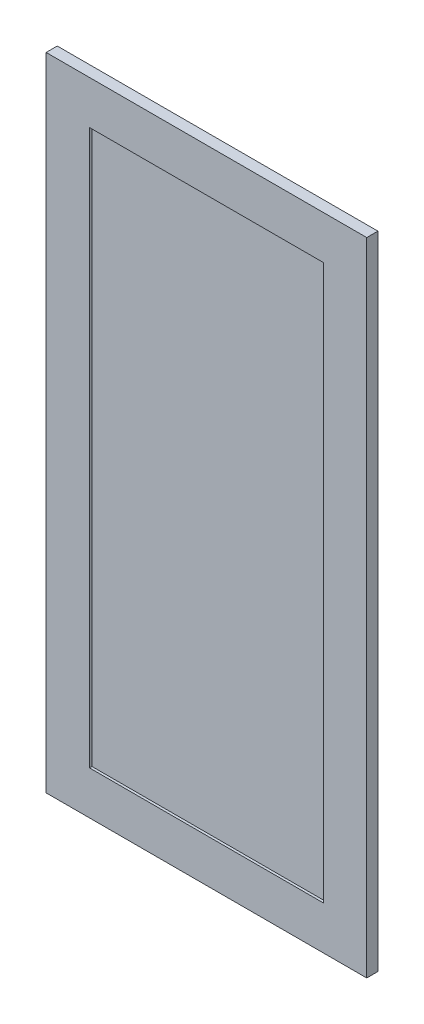
ISO-10303-21;
HEADER;
FILE_DESCRIPTION(('STEP AP214'),'2;1');
FILE_NAME('part.step','',(''),(''),'','','');
FILE_SCHEMA(('AUTOMOTIVE_DESIGN { 1 0 10303 214 1 1 1 1 }'));
ENDSEC;
DATA;
#1=APPLICATION_CONTEXT('core data for automotive mechanical design processes');
#2=APPLICATION_PROTOCOL_DEFINITION('international standard','automotive_design',2000,#1);
#3=PRODUCT_CONTEXT('',#1,'mechanical');
#4=PRODUCT('Part','Part','',(#3));
#5=PRODUCT_RELATED_PRODUCT_CATEGORY('part','',(#4));
#6=PRODUCT_DEFINITION_FORMATION('','',#4);
#7=PRODUCT_DEFINITION_CONTEXT('part definition',#1,'design');
#8=PRODUCT_DEFINITION('design','',#6,#7);
#9=PRODUCT_DEFINITION_SHAPE('','',#8);
#10=(LENGTH_UNIT() NAMED_UNIT(*) SI_UNIT(.MILLI.,.METRE.));
#11=(NAMED_UNIT(*) PLANE_ANGLE_UNIT() SI_UNIT($,.RADIAN.));
#12=(NAMED_UNIT(*) SI_UNIT($,.STERADIAN.) SOLID_ANGLE_UNIT());
#13=UNCERTAINTY_MEASURE_WITH_UNIT(LENGTH_MEASURE(1.E-05),#10,'distance_accuracy_value','');
#14=(GEOMETRIC_REPRESENTATION_CONTEXT(3) GLOBAL_UNCERTAINTY_ASSIGNED_CONTEXT((#13)) GLOBAL_UNIT_ASSIGNED_CONTEXT((#10,
#11,#12)) REPRESENTATION_CONTEXT('',''));
#15=CARTESIAN_POINT('',(0.,0.,0.));
#16=DIRECTION('',(0.,0.,1.));
#17=DIRECTION('',(1.,0.,0.));
#18=AXIS2_PLACEMENT_3D('',#15,#16,#17);
#19=CARTESIAN_POINT('',(259.,518.,18.));
#20=DIRECTION('',(-1.,0.,0.));
#21=DIRECTION('',(0.,-1.,0.));
#22=AXIS2_PLACEMENT_3D('',#19,#20,#21);
#23=PLANE('',#22);
#24=DIRECTION('',(0.,1.,0.));
#25=VECTOR('',#24,1.);
#26=CARTESIAN_POINT('',(259.,518.,0.));
#27=LINE('',#26,#25);
#28=CARTESIAN_POINT('',(259.,-518.,0.));
#29=VERTEX_POINT('',#28);
#30=CARTESIAN_POINT('',(259.,518.,0.));
#31=VERTEX_POINT('',#30);
#32=EDGE_CURVE('E141',#29,#31,#27,.T.);
#33=ORIENTED_EDGE('',*,*,#32,.T.);
#34=DIRECTION('',(0.,0.,-1.));
#35=VECTOR('',#34,1.);
#36=CARTESIAN_POINT('',(259.,518.,18.));
#37=LINE('',#36,#35);
#38=CARTESIAN_POINT('',(259.,518.,18.));
#39=VERTEX_POINT('',#38);
#40=EDGE_CURVE('E11',#39,#31,#37,.T.);
#41=ORIENTED_EDGE('',*,*,#40,.F.);
#42=DIRECTION('',(0.,1.,0.));
#43=VECTOR('',#42,1.);
#44=CARTESIAN_POINT('',(259.,518.,18.));
#45=LINE('',#44,#43);
#46=CARTESIAN_POINT('',(259.,-518.,18.));
#47=VERTEX_POINT('',#46);
#48=EDGE_CURVE('E145',#47,#39,#45,.T.);
#49=ORIENTED_EDGE('',*,*,#48,.F.);
#50=DIRECTION('',(0.,0.,-1.));
#51=VECTOR('',#50,1.);
#52=CARTESIAN_POINT('',(259.,-518.,18.));
#53=LINE('',#52,#51);
#54=EDGE_CURVE('E151',#47,#29,#53,.T.);
#55=ORIENTED_EDGE('',*,*,#54,.T.);
#56=EDGE_LOOP('',(#33,#41,#49,#55));
#57=FACE_BOUND('',#56,.T.);
#58=ADVANCED_FACE('F33',(#57),#23,.F.);
#59=CARTESIAN_POINT('',(-259.,518.,18.));
#60=DIRECTION('',(0.,-1.,0.));
#61=DIRECTION('',(0.,0.,-1.));
#62=AXIS2_PLACEMENT_3D('',#59,#60,#61);
#63=PLANE('',#62);
#64=DIRECTION('',(-1.,0.,0.));
#65=VECTOR('',#64,1.);
#66=CARTESIAN_POINT('',(-259.,518.,0.));
#67=LINE('',#66,#65);
#68=CARTESIAN_POINT('',(-259.,518.,0.));
#69=VERTEX_POINT('',#68);
#70=EDGE_CURVE('E154',#31,#69,#67,.T.);
#71=ORIENTED_EDGE('',*,*,#70,.T.);
#72=DIRECTION('',(0.,0.,-1.));
#73=VECTOR('',#72,1.);
#74=CARTESIAN_POINT('',(-259.,518.,18.));
#75=LINE('',#74,#73);
#76=CARTESIAN_POINT('',(-259.,518.,18.));
#77=VERTEX_POINT('',#76);
#78=EDGE_CURVE('E40',#77,#69,#75,.T.);
#79=ORIENTED_EDGE('',*,*,#78,.F.);
#80=DIRECTION('',(-1.,0.,0.));
#81=VECTOR('',#80,1.);
#82=CARTESIAN_POINT('',(-259.,518.,18.));
#83=LINE('',#82,#81);
#84=EDGE_CURVE('E84',#39,#77,#83,.T.);
#85=ORIENTED_EDGE('',*,*,#84,.F.);
#86=ORIENTED_EDGE('',*,*,#40,.T.);
#87=EDGE_LOOP('',(#71,#79,#85,#86));
#88=FACE_BOUND('',#87,.T.);
#89=ADVANCED_FACE('F183',(#88),#63,.F.);
#90=CARTESIAN_POINT('',(-259.,518.,18.));
#91=DIRECTION('',(1.,0.,0.));
#92=DIRECTION('',(0.,1.,0.));
#93=AXIS2_PLACEMENT_3D('',#90,#91,#92);
#94=PLANE('',#93);
#95=DIRECTION('',(0.,-1.,0.));
#96=VECTOR('',#95,1.);
#97=CARTESIAN_POINT('',(-259.,518.,0.));
#98=LINE('',#97,#96);
#99=CARTESIAN_POINT('',(-259.,-518.,0.));
#100=VERTEX_POINT('',#99);
#101=EDGE_CURVE('E156',#69,#100,#98,.T.);
#102=ORIENTED_EDGE('',*,*,#101,.T.);
#103=DIRECTION('',(0.,0.,-1.));
#104=VECTOR('',#103,1.);
#105=CARTESIAN_POINT('',(-259.,-518.,18.));
#106=LINE('',#105,#104);
#107=CARTESIAN_POINT('',(-259.,-518.,18.));
#108=VERTEX_POINT('',#107);
#109=EDGE_CURVE('E160',#108,#100,#106,.T.);
#110=ORIENTED_EDGE('',*,*,#109,.F.);
#111=DIRECTION('',(0.,-1.,0.));
#112=VECTOR('',#111,1.);
#113=CARTESIAN_POINT('',(-259.,518.,18.));
#114=LINE('',#113,#112);
#115=EDGE_CURVE('E148',#77,#108,#114,.T.);
#116=ORIENTED_EDGE('',*,*,#115,.F.);
#117=ORIENTED_EDGE('',*,*,#78,.T.);
#118=EDGE_LOOP('',(#102,#110,#116,#117));
#119=FACE_BOUND('',#118,.T.);
#120=ADVANCED_FACE('F165',(#119),#94,.F.);
#121=CARTESIAN_POINT('',(-259.,-518.,18.));
#122=DIRECTION('',(0.,1.,0.));
#123=DIRECTION('',(0.,0.,1.));
#124=AXIS2_PLACEMENT_3D('',#121,#122,#123);
#125=PLANE('',#124);
#126=DIRECTION('',(1.,0.,0.));
#127=VECTOR('',#126,1.);
#128=CARTESIAN_POINT('',(-259.,-518.,0.));
#129=LINE('',#128,#127);
#130=EDGE_CURVE('E77',#100,#29,#129,.T.);
#131=ORIENTED_EDGE('',*,*,#130,.T.);
#132=ORIENTED_EDGE('',*,*,#54,.F.);
#133=DIRECTION('',(1.,0.,0.));
#134=VECTOR('',#133,1.);
#135=CARTESIAN_POINT('',(-259.,-518.,18.));
#136=LINE('',#135,#134);
#137=EDGE_CURVE('E56',#108,#47,#136,.T.);
#138=ORIENTED_EDGE('',*,*,#137,.F.);
#139=ORIENTED_EDGE('',*,*,#109,.T.);
#140=EDGE_LOOP('',(#131,#132,#138,#139));
#141=FACE_BOUND('',#140,.T.);
#142=ADVANCED_FACE('F173',(#141),#125,.F.);
#143=CARTESIAN_POINT('',(0.,0.,18.));
#144=DIRECTION('',(0.,0.,1.));
#145=DIRECTION('',(1.,0.,0.));
#146=AXIS2_PLACEMENT_3D('',#143,#144,#145);
#147=PLANE('',#146);
#148=DIRECTION('',(0.,1.,0.));
#149=VECTOR('',#148,1.);
#150=CARTESIAN_POINT('',(189.,448.,18.));
#151=LINE('',#150,#149);
#152=CARTESIAN_POINT('',(189.,-448.,18.));
#153=VERTEX_POINT('',#152);
#154=CARTESIAN_POINT('',(189.,448.,18.));
#155=VERTEX_POINT('',#154);
#156=EDGE_CURVE('E47',#153,#155,#151,.T.);
#157=ORIENTED_EDGE('',*,*,#156,.F.);
#158=DIRECTION('',(1.,0.,0.));
#159=VECTOR('',#158,1.);
#160=CARTESIAN_POINT('',(-189.,-448.,18.));
#161=LINE('',#160,#159);
#162=CARTESIAN_POINT('',(-189.,-448.,18.));
#163=VERTEX_POINT('',#162);
#164=EDGE_CURVE('E126',#163,#153,#161,.T.);
#165=ORIENTED_EDGE('',*,*,#164,.F.);
#166=DIRECTION('',(0.,-1.,0.));
#167=VECTOR('',#166,1.);
#168=CARTESIAN_POINT('',(-189.,448.,18.));
#169=LINE('',#168,#167);
#170=CARTESIAN_POINT('',(-189.,448.,18.));
#171=VERTEX_POINT('',#170);
#172=EDGE_CURVE('E129',#171,#163,#169,.T.);
#173=ORIENTED_EDGE('',*,*,#172,.F.);
#174=DIRECTION('',(-1.,0.,0.));
#175=VECTOR('',#174,1.);
#176=CARTESIAN_POINT('',(-189.,448.,18.));
#177=LINE('',#176,#175);
#178=EDGE_CURVE('E135',#155,#171,#177,.T.);
#179=ORIENTED_EDGE('',*,*,#178,.F.);
#180=EDGE_LOOP('',(#157,#165,#173,#179));
#181=FACE_BOUND('',#180,.T.);
#182=ORIENTED_EDGE('',*,*,#48,.T.);
#183=ORIENTED_EDGE('',*,*,#84,.T.);
#184=ORIENTED_EDGE('',*,*,#115,.T.);
#185=ORIENTED_EDGE('',*,*,#137,.T.);
#186=EDGE_LOOP('',(#182,#183,#184,#185));
#187=FACE_BOUND('',#186,.T.);
#188=ADVANCED_FACE('F175',(#181,#187),#147,.T.);
#189=CARTESIAN_POINT('',(0.,0.,0.));
#190=DIRECTION('',(0.,0.,1.));
#191=DIRECTION('',(1.,0.,0.));
#192=AXIS2_PLACEMENT_3D('',#189,#190,#191);
#193=PLANE('',#192);
#194=ORIENTED_EDGE('',*,*,#32,.F.);
#195=ORIENTED_EDGE('',*,*,#130,.F.);
#196=ORIENTED_EDGE('',*,*,#101,.F.);
#197=ORIENTED_EDGE('',*,*,#70,.F.);
#198=EDGE_LOOP('',(#194,#195,#196,#197));
#199=FACE_BOUND('',#198,.T.);
#200=ADVANCED_FACE('F169',(#199),#193,.F.);
#201=CARTESIAN_POINT('',(189.,448.,14.));
#202=DIRECTION('',(1.,0.,0.));
#203=DIRECTION('',(0.,0.,-1.));
#204=AXIS2_PLACEMENT_3D('',#201,#202,#203);
#205=PLANE('',#204);
#206=ORIENTED_EDGE('',*,*,#156,.T.);
#207=DIRECTION('',(0.,0.,1.));
#208=VECTOR('',#207,1.);
#209=CARTESIAN_POINT('',(189.,448.,14.));
#210=LINE('',#209,#208);
#211=CARTESIAN_POINT('',(189.,448.,14.));
#212=VERTEX_POINT('',#211);
#213=EDGE_CURVE('E104',#212,#155,#210,.T.);
#214=ORIENTED_EDGE('',*,*,#213,.F.);
#215=DIRECTION('',(0.,1.,0.));
#216=VECTOR('',#215,1.);
#217=CARTESIAN_POINT('',(189.,448.,14.));
#218=LINE('',#217,#216);
#219=CARTESIAN_POINT('',(189.,-448.,14.));
#220=VERTEX_POINT('',#219);
#221=EDGE_CURVE('E108',#220,#212,#218,.T.);
#222=ORIENTED_EDGE('',*,*,#221,.F.);
#223=DIRECTION('',(0.,0.,1.));
#224=VECTOR('',#223,1.);
#225=CARTESIAN_POINT('',(189.,-448.,14.));
#226=LINE('',#225,#224);
#227=EDGE_CURVE('E139',#220,#153,#226,.T.);
#228=ORIENTED_EDGE('',*,*,#227,.T.);
#229=EDGE_LOOP('',(#206,#214,#222,#228));
#230=FACE_BOUND('',#229,.T.);
#231=ADVANCED_FACE('F106',(#230),#205,.F.);
#232=CARTESIAN_POINT('',(-189.,-448.,14.));
#233=DIRECTION('',(0.,-1.,0.));
#234=DIRECTION('',(0.,0.,-1.));
#235=AXIS2_PLACEMENT_3D('',#232,#233,#234);
#236=PLANE('',#235);
#237=ORIENTED_EDGE('',*,*,#164,.T.);
#238=ORIENTED_EDGE('',*,*,#227,.F.);
#239=DIRECTION('',(1.,0.,0.));
#240=VECTOR('',#239,1.);
#241=CARTESIAN_POINT('',(-189.,-448.,14.));
#242=LINE('',#241,#240);
#243=CARTESIAN_POINT('',(-189.,-448.,14.));
#244=VERTEX_POINT('',#243);
#245=EDGE_CURVE('E114',#244,#220,#242,.T.);
#246=ORIENTED_EDGE('',*,*,#245,.F.);
#247=DIRECTION('',(0.,0.,1.));
#248=VECTOR('',#247,1.);
#249=CARTESIAN_POINT('',(-189.,-448.,14.));
#250=LINE('',#249,#248);
#251=EDGE_CURVE('E142',#244,#163,#250,.T.);
#252=ORIENTED_EDGE('',*,*,#251,.T.);
#253=EDGE_LOOP('',(#237,#238,#246,#252));
#254=FACE_BOUND('',#253,.T.);
#255=ADVANCED_FACE('F222',(#254),#236,.F.);
#256=CARTESIAN_POINT('',(-189.,448.,14.));
#257=DIRECTION('',(-1.,0.,0.));
#258=DIRECTION('',(0.,0.,1.));
#259=AXIS2_PLACEMENT_3D('',#256,#257,#258);
#260=PLANE('',#259);
#261=ORIENTED_EDGE('',*,*,#172,.T.);
#262=ORIENTED_EDGE('',*,*,#251,.F.);
#263=DIRECTION('',(0.,-1.,0.));
#264=VECTOR('',#263,1.);
#265=CARTESIAN_POINT('',(-189.,448.,14.));
#266=LINE('',#265,#264);
#267=CARTESIAN_POINT('',(-189.,448.,14.));
#268=VERTEX_POINT('',#267);
#269=EDGE_CURVE('E122',#268,#244,#266,.T.);
#270=ORIENTED_EDGE('',*,*,#269,.F.);
#271=DIRECTION('',(0.,0.,1.));
#272=VECTOR('',#271,1.);
#273=CARTESIAN_POINT('',(-189.,448.,14.));
#274=LINE('',#273,#272);
#275=EDGE_CURVE('E113',#268,#171,#274,.T.);
#276=ORIENTED_EDGE('',*,*,#275,.T.);
#277=EDGE_LOOP('',(#261,#262,#270,#276));
#278=FACE_BOUND('',#277,.T.);
#279=ADVANCED_FACE('F231',(#278),#260,.F.);
#280=CARTESIAN_POINT('',(-189.,448.,14.));
#281=DIRECTION('',(0.,1.,0.));
#282=DIRECTION('',(0.,0.,1.));
#283=AXIS2_PLACEMENT_3D('',#280,#281,#282);
#284=PLANE('',#283);
#285=ORIENTED_EDGE('',*,*,#178,.T.);
#286=ORIENTED_EDGE('',*,*,#275,.F.);
#287=DIRECTION('',(-1.,0.,0.));
#288=VECTOR('',#287,1.);
#289=CARTESIAN_POINT('',(-189.,448.,14.));
#290=LINE('',#289,#288);
#291=EDGE_CURVE('E117',#212,#268,#290,.T.);
#292=ORIENTED_EDGE('',*,*,#291,.F.);
#293=ORIENTED_EDGE('',*,*,#213,.T.);
#294=EDGE_LOOP('',(#285,#286,#292,#293));
#295=FACE_BOUND('',#294,.T.);
#296=ADVANCED_FACE('F118',(#295),#284,.F.);
#297=CARTESIAN_POINT('',(0.,0.,14.));
#298=DIRECTION('',(0.,0.,1.));
#299=DIRECTION('',(1.,0.,0.));
#300=AXIS2_PLACEMENT_3D('',#297,#298,#299);
#301=PLANE('',#300);
#302=ORIENTED_EDGE('',*,*,#221,.T.);
#303=ORIENTED_EDGE('',*,*,#291,.T.);
#304=ORIENTED_EDGE('',*,*,#269,.T.);
#305=ORIENTED_EDGE('',*,*,#245,.T.);
#306=EDGE_LOOP('',(#302,#303,#304,#305));
#307=FACE_BOUND('',#306,.T.);
#308=ADVANCED_FACE('F124',(#307),#301,.T.);
#309=CLOSED_SHELL('',(#58,#89,#120,#142,#188,#200,#231,#255,#279,#296,#308));
#310=MANIFOLD_SOLID_BREP('B2',#309);
#311=ADVANCED_BREP_SHAPE_REPRESENTATION('',(#18,#310),#14);
#312=SHAPE_DEFINITION_REPRESENTATION(#9,#311);
ENDSEC;
END-ISO-10303-21;
